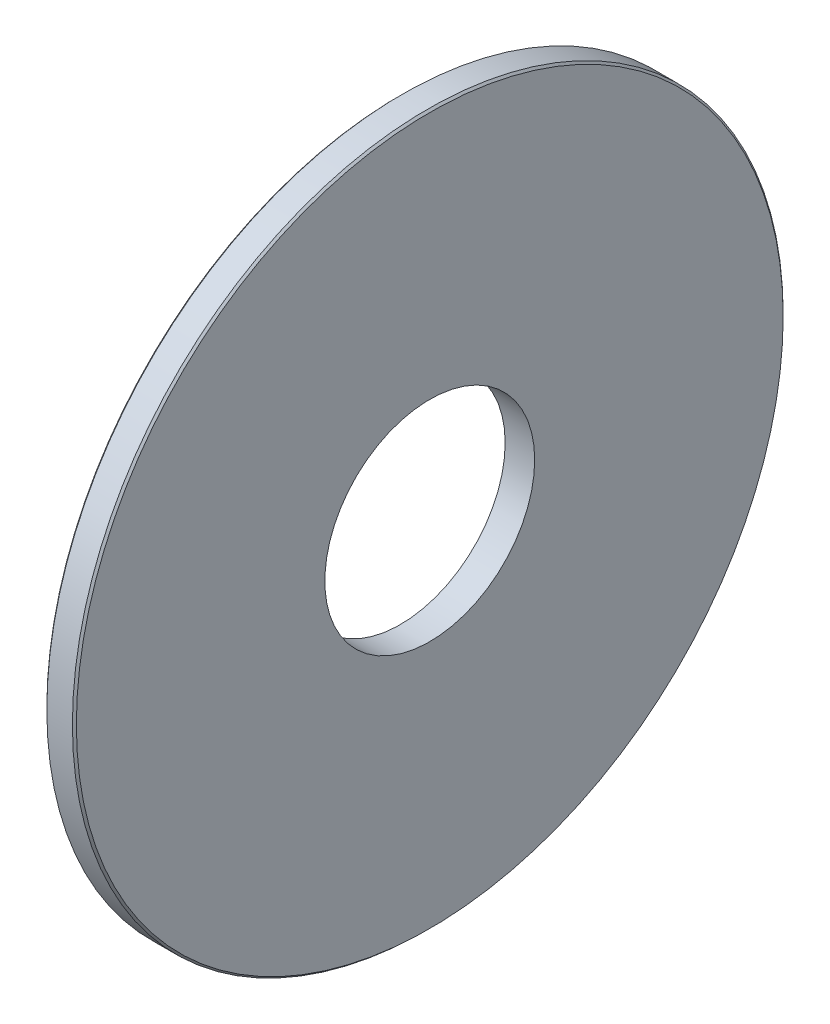
ISO-10303-21;
HEADER;
FILE_DESCRIPTION(('STEP AP214'),'2;1');
FILE_NAME('part.step','',(''),(''),'','','');
FILE_SCHEMA(('AUTOMOTIVE_DESIGN { 1 0 10303 214 1 1 1 1 }'));
ENDSEC;
DATA;
#1=APPLICATION_CONTEXT('core data for automotive mechanical design processes');
#2=APPLICATION_PROTOCOL_DEFINITION('international standard','automotive_design',2000,#1);
#3=PRODUCT_CONTEXT('',#1,'mechanical');
#4=PRODUCT('Part','Part','',(#3));
#5=PRODUCT_RELATED_PRODUCT_CATEGORY('part','',(#4));
#6=PRODUCT_DEFINITION_FORMATION('','',#4);
#7=PRODUCT_DEFINITION_CONTEXT('part definition',#1,'design');
#8=PRODUCT_DEFINITION('design','',#6,#7);
#9=PRODUCT_DEFINITION_SHAPE('','',#8);
#10=(LENGTH_UNIT() NAMED_UNIT(*) SI_UNIT(.MILLI.,.METRE.));
#11=(NAMED_UNIT(*) PLANE_ANGLE_UNIT() SI_UNIT($,.RADIAN.));
#12=(NAMED_UNIT(*) SI_UNIT($,.STERADIAN.) SOLID_ANGLE_UNIT());
#13=UNCERTAINTY_MEASURE_WITH_UNIT(LENGTH_MEASURE(1.E-05),#10,'distance_accuracy_value','');
#14=(GEOMETRIC_REPRESENTATION_CONTEXT(3) GLOBAL_UNCERTAINTY_ASSIGNED_CONTEXT((#13)) GLOBAL_UNIT_ASSIGNED_CONTEXT((#10,
#11,#12)) REPRESENTATION_CONTEXT('',''));
#15=CARTESIAN_POINT('',(0.,0.,0.));
#16=DIRECTION('',(0.,0.,1.));
#17=DIRECTION('',(1.,0.,0.));
#18=AXIS2_PLACEMENT_3D('',#15,#16,#17);
#19=CARTESIAN_POINT('',(-1.055,0.,0.));
#20=DIRECTION('',(1.,0.,0.));
#21=DIRECTION('',(0.,0.,-1.));
#22=AXIS2_PLACEMENT_3D('',#19,#20,#21);
#23=PLANE('',#22);
#24=CARTESIAN_POINT('',(-1.055,0.,0.));
#25=DIRECTION('',(1.,0.,0.));
#26=DIRECTION('',(0.,0.,-1.));
#27=AXIS2_PLACEMENT_3D('',#24,#25,#26);
#28=CIRCLE('',#27,7.5);
#29=CARTESIAN_POINT('',(-1.055,0.,-7.5));
#30=VERTEX_POINT('',#29);
#31=EDGE_CURVE('E61',#30,#30,#28,.T.);
#32=ORIENTED_EDGE('',*,*,#31,.T.);
#33=EDGE_LOOP('',(#32));
#34=FACE_BOUND('',#33,.T.);
#35=CARTESIAN_POINT('',(-1.055,0.,0.));
#36=DIRECTION('',(-1.,0.,0.));
#37=DIRECTION('',(0.,0.,1.));
#38=AXIS2_PLACEMENT_3D('',#35,#36,#37);
#39=CIRCLE('',#38,25.2585786437627);
#40=CARTESIAN_POINT('',(-1.055,0.,25.2585786437627));
#41=VERTEX_POINT('',#40);
#42=EDGE_CURVE('E10',#41,#41,#39,.T.);
#43=ORIENTED_EDGE('',*,*,#42,.T.);
#44=EDGE_LOOP('',(#43));
#45=FACE_BOUND('',#44,.T.);
#46=ADVANCED_FACE('F38',(#34,#45),#23,.F.);
#47=CARTESIAN_POINT('',(-0.913578643762691,0.,0.));
#48=DIRECTION('',(1.,0.,0.));
#49=DIRECTION('',(0.,0.,-1.));
#50=AXIS2_PLACEMENT_3D('',#47,#48,#49);
#51=CONICAL_SURFACE('',#50,25.4,0.785398163397451);
#52=ORIENTED_EDGE('',*,*,#42,.F.);
#53=EDGE_LOOP('',(#52));
#54=FACE_BOUND('',#53,.T.);
#55=CARTESIAN_POINT('',(-0.913578643762691,0.,0.));
#56=DIRECTION('',(-1.,0.,0.));
#57=DIRECTION('',(0.,0.,1.));
#58=AXIS2_PLACEMENT_3D('',#55,#56,#57);
#59=CIRCLE('',#58,25.4);
#60=CARTESIAN_POINT('',(-0.913578643762691,0.,25.4));
#61=VERTEX_POINT('',#60);
#62=EDGE_CURVE('E45',#61,#61,#59,.T.);
#63=ORIENTED_EDGE('',*,*,#62,.T.);
#64=EDGE_LOOP('',(#63));
#65=FACE_BOUND('',#64,.T.);
#66=ADVANCED_FACE('F88',(#54,#65),#51,.T.);
#67=CARTESIAN_POINT('',(-1.055,0.,0.));
#68=DIRECTION('',(-1.,0.,0.));
#69=DIRECTION('',(0.,0.,1.));
#70=AXIS2_PLACEMENT_3D('',#67,#68,#69);
#71=CYLINDRICAL_SURFACE('',#70,25.4);
#72=ORIENTED_EDGE('',*,*,#62,.F.);
#73=EDGE_LOOP('',(#72));
#74=FACE_BOUND('',#73,.T.);
#75=CARTESIAN_POINT('',(0.913578643762692,0.,0.));
#76=DIRECTION('',(-1.,0.,0.));
#77=DIRECTION('',(0.,0.,1.));
#78=AXIS2_PLACEMENT_3D('',#75,#76,#77);
#79=CIRCLE('',#78,25.4);
#80=CARTESIAN_POINT('',(0.913578643762692,0.,25.4));
#81=VERTEX_POINT('',#80);
#82=EDGE_CURVE('E50',#81,#81,#79,.T.);
#83=ORIENTED_EDGE('',*,*,#82,.T.);
#84=EDGE_LOOP('',(#83));
#85=FACE_BOUND('',#84,.T.);
#86=ADVANCED_FACE('F81',(#74,#85),#71,.T.);
#87=CARTESIAN_POINT('',(1.055,0.,0.));
#88=DIRECTION('',(-1.,0.,0.));
#89=DIRECTION('',(0.,0.,1.));
#90=AXIS2_PLACEMENT_3D('',#87,#88,#89);
#91=CONICAL_SURFACE('',#90,25.2585786437627,0.78539816339745);
#92=ORIENTED_EDGE('',*,*,#82,.F.);
#93=EDGE_LOOP('',(#92));
#94=FACE_BOUND('',#93,.T.);
#95=CARTESIAN_POINT('',(1.055,0.,0.));
#96=DIRECTION('',(-1.,0.,0.));
#97=DIRECTION('',(0.,0.,1.));
#98=AXIS2_PLACEMENT_3D('',#95,#96,#97);
#99=CIRCLE('',#98,25.2585786437627);
#100=CARTESIAN_POINT('',(1.055,0.,25.2585786437627));
#101=VERTEX_POINT('',#100);
#102=EDGE_CURVE('E55',#101,#101,#99,.T.);
#103=ORIENTED_EDGE('',*,*,#102,.T.);
#104=EDGE_LOOP('',(#103));
#105=FACE_BOUND('',#104,.T.);
#106=ADVANCED_FACE('F76',(#94,#105),#91,.T.);
#107=CARTESIAN_POINT('',(1.055,0.,0.));
#108=DIRECTION('',(-1.,0.,0.));
#109=DIRECTION('',(0.,0.,1.));
#110=AXIS2_PLACEMENT_3D('',#107,#108,#109);
#111=PLANE('',#110);
#112=CARTESIAN_POINT('',(1.055,0.,0.));
#113=DIRECTION('',(1.,0.,0.));
#114=DIRECTION('',(0.,0.,-1.));
#115=AXIS2_PLACEMENT_3D('',#112,#113,#114);
#116=CIRCLE('',#115,7.5);
#117=CARTESIAN_POINT('',(1.055,0.,-7.5));
#118=VERTEX_POINT('',#117);
#119=EDGE_CURVE('E65',#118,#118,#116,.T.);
#120=ORIENTED_EDGE('',*,*,#119,.F.);
#121=EDGE_LOOP('',(#120));
#122=FACE_BOUND('',#121,.T.);
#123=ORIENTED_EDGE('',*,*,#102,.F.);
#124=EDGE_LOOP('',(#123));
#125=FACE_BOUND('',#124,.T.);
#126=ADVANCED_FACE('F73',(#122,#125),#111,.F.);
#127=CARTESIAN_POINT('',(-8.945,0.,0.));
#128=DIRECTION('',(1.,0.,0.));
#129=DIRECTION('',(0.,0.,-1.));
#130=AXIS2_PLACEMENT_3D('',#127,#128,#129);
#131=CYLINDRICAL_SURFACE('',#130,7.5);
#132=ORIENTED_EDGE('',*,*,#119,.T.);
#133=EDGE_LOOP('',(#132));
#134=FACE_BOUND('',#133,.T.);
#135=ORIENTED_EDGE('',*,*,#31,.F.);
#136=EDGE_LOOP('',(#135));
#137=FACE_BOUND('',#136,.T.);
#138=ADVANCED_FACE('F70',(#134,#137),#131,.F.);
#139=CLOSED_SHELL('',(#46,#66,#86,#106,#126,#138));
#140=MANIFOLD_SOLID_BREP('B2',#139);
#141=ADVANCED_BREP_SHAPE_REPRESENTATION('',(#18,#140),#14);
#142=SHAPE_DEFINITION_REPRESENTATION(#9,#141);
ENDSEC;
END-ISO-10303-21;
